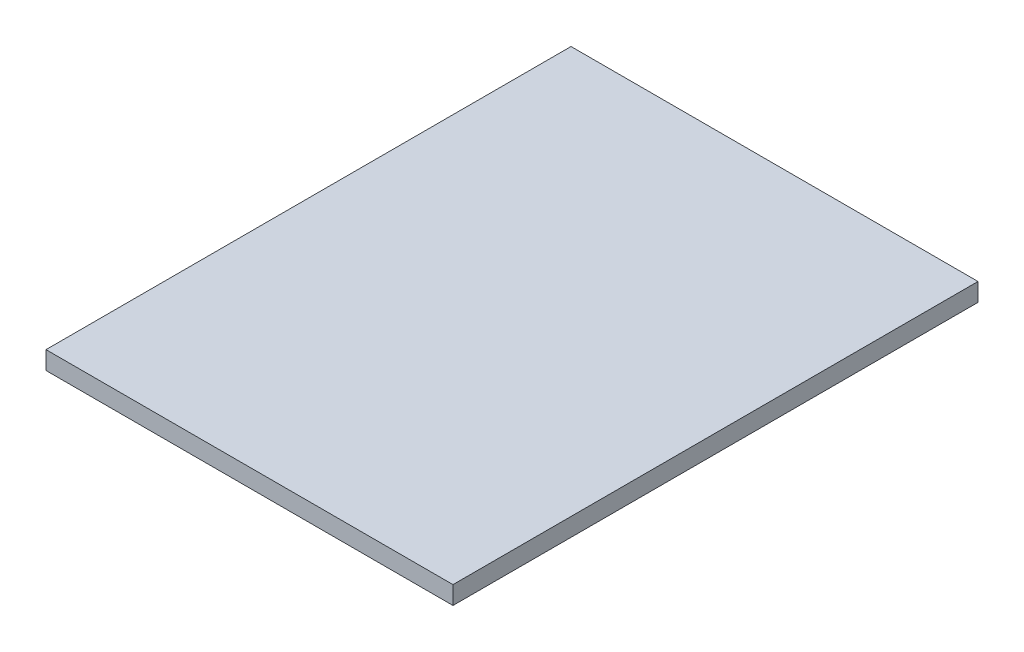
ISO-10303-21;
HEADER;
FILE_DESCRIPTION(('STEP AP214'),'2;1');
FILE_NAME('part.step','',(''),(''),'','','');
FILE_SCHEMA(('AUTOMOTIVE_DESIGN { 1 0 10303 214 1 1 1 1 }'));
ENDSEC;
DATA;
#1=APPLICATION_CONTEXT('core data for automotive mechanical design processes');
#2=APPLICATION_PROTOCOL_DEFINITION('international standard','automotive_design',2000,#1);
#3=PRODUCT_CONTEXT('',#1,'mechanical');
#4=PRODUCT('Part','Part','',(#3));
#5=PRODUCT_RELATED_PRODUCT_CATEGORY('part','',(#4));
#6=PRODUCT_DEFINITION_FORMATION('','',#4);
#7=PRODUCT_DEFINITION_CONTEXT('part definition',#1,'design');
#8=PRODUCT_DEFINITION('design','',#6,#7);
#9=PRODUCT_DEFINITION_SHAPE('','',#8);
#10=(LENGTH_UNIT() NAMED_UNIT(*) SI_UNIT(.MILLI.,.METRE.));
#11=(NAMED_UNIT(*) PLANE_ANGLE_UNIT() SI_UNIT($,.RADIAN.));
#12=(NAMED_UNIT(*) SI_UNIT($,.STERADIAN.) SOLID_ANGLE_UNIT());
#13=UNCERTAINTY_MEASURE_WITH_UNIT(LENGTH_MEASURE(1.E-05),#10,'distance_accuracy_value','');
#14=(GEOMETRIC_REPRESENTATION_CONTEXT(3) GLOBAL_UNCERTAINTY_ASSIGNED_CONTEXT((#13)) GLOBAL_UNIT_ASSIGNED_CONTEXT((#10,
#11,#12)) REPRESENTATION_CONTEXT('',''));
#15=CARTESIAN_POINT('',(0.,0.,0.));
#16=DIRECTION('',(0.,0.,1.));
#17=DIRECTION('',(1.,0.,0.));
#18=AXIS2_PLACEMENT_3D('',#15,#16,#17);
#19=CARTESIAN_POINT('',(0.,1.,0.));
#20=DIRECTION('',(1.,0.,0.));
#21=DIRECTION('',(0.,0.,-1.));
#22=AXIS2_PLACEMENT_3D('',#19,#20,#21);
#23=PLANE('',#22);
#24=DIRECTION('',(0.,0.,1.));
#25=VECTOR('',#24,1.);
#26=CARTESIAN_POINT('',(0.,0.,0.));
#27=LINE('',#26,#25);
#28=CARTESIAN_POINT('',(0.,0.,-29.));
#29=VERTEX_POINT('',#28);
#30=CARTESIAN_POINT('',(0.,0.,0.));
#31=VERTEX_POINT('',#30);
#32=EDGE_CURVE('E97',#29,#31,#27,.T.);
#33=ORIENTED_EDGE('',*,*,#32,.T.);
#34=DIRECTION('',(0.,-1.,0.));
#35=VECTOR('',#34,1.);
#36=CARTESIAN_POINT('',(0.,1.,0.));
#37=LINE('',#36,#35);
#38=CARTESIAN_POINT('',(0.,1.,0.));
#39=VERTEX_POINT('',#38);
#40=EDGE_CURVE('E11',#39,#31,#37,.T.);
#41=ORIENTED_EDGE('',*,*,#40,.F.);
#42=DIRECTION('',(0.,0.,1.));
#43=VECTOR('',#42,1.);
#44=CARTESIAN_POINT('',(0.,1.,0.));
#45=LINE('',#44,#43);
#46=CARTESIAN_POINT('',(0.,1.,-29.));
#47=VERTEX_POINT('',#46);
#48=EDGE_CURVE('E85',#47,#39,#45,.T.);
#49=ORIENTED_EDGE('',*,*,#48,.F.);
#50=DIRECTION('',(0.,-1.,0.));
#51=VECTOR('',#50,1.);
#52=CARTESIAN_POINT('',(0.,1.,-29.));
#53=LINE('',#52,#51);
#54=EDGE_CURVE('E93',#47,#29,#53,.T.);
#55=ORIENTED_EDGE('',*,*,#54,.T.);
#56=EDGE_LOOP('',(#33,#41,#49,#55));
#57=FACE_BOUND('',#56,.T.);
#58=ADVANCED_FACE('F34',(#57),#23,.F.);
#59=CARTESIAN_POINT('',(0.,1.,0.));
#60=DIRECTION('',(0.,0.,-1.));
#61=DIRECTION('',(-1.,0.,0.));
#62=AXIS2_PLACEMENT_3D('',#59,#60,#61);
#63=PLANE('',#62);
#64=DIRECTION('',(1.,0.,0.));
#65=VECTOR('',#64,1.);
#66=CARTESIAN_POINT('',(0.,0.,0.));
#67=LINE('',#66,#65);
#68=CARTESIAN_POINT('',(22.48,0.,0.));
#69=VERTEX_POINT('',#68);
#70=EDGE_CURVE('E89',#31,#69,#67,.T.);
#71=ORIENTED_EDGE('',*,*,#70,.T.);
#72=DIRECTION('',(0.,-1.,0.));
#73=VECTOR('',#72,1.);
#74=CARTESIAN_POINT('',(22.48,1.,0.));
#75=LINE('',#74,#73);
#76=CARTESIAN_POINT('',(22.48,1.,0.));
#77=VERTEX_POINT('',#76);
#78=EDGE_CURVE('E42',#77,#69,#75,.T.);
#79=ORIENTED_EDGE('',*,*,#78,.F.);
#80=DIRECTION('',(1.,0.,0.));
#81=VECTOR('',#80,1.);
#82=CARTESIAN_POINT('',(0.,1.,0.));
#83=LINE('',#82,#81);
#84=EDGE_CURVE('E80',#39,#77,#83,.T.);
#85=ORIENTED_EDGE('',*,*,#84,.F.);
#86=ORIENTED_EDGE('',*,*,#40,.T.);
#87=EDGE_LOOP('',(#71,#79,#85,#86));
#88=FACE_BOUND('',#87,.T.);
#89=ADVANCED_FACE('F88',(#88),#63,.F.);
#90=CARTESIAN_POINT('',(22.48,1.,0.));
#91=DIRECTION('',(-1.,0.,0.));
#92=DIRECTION('',(0.,0.,1.));
#93=AXIS2_PLACEMENT_3D('',#90,#91,#92);
#94=PLANE('',#93);
#95=DIRECTION('',(0.,0.,-1.));
#96=VECTOR('',#95,1.);
#97=CARTESIAN_POINT('',(22.48,0.,0.));
#98=LINE('',#97,#96);
#99=CARTESIAN_POINT('',(22.48,0.,-29.));
#100=VERTEX_POINT('',#99);
#101=EDGE_CURVE('E67',#69,#100,#98,.T.);
#102=ORIENTED_EDGE('',*,*,#101,.T.);
#103=DIRECTION('',(0.,-1.,0.));
#104=VECTOR('',#103,1.);
#105=CARTESIAN_POINT('',(22.48,1.,-29.));
#106=LINE('',#105,#104);
#107=CARTESIAN_POINT('',(22.48,1.,-29.));
#108=VERTEX_POINT('',#107);
#109=EDGE_CURVE('E90',#108,#100,#106,.T.);
#110=ORIENTED_EDGE('',*,*,#109,.F.);
#111=DIRECTION('',(0.,0.,-1.));
#112=VECTOR('',#111,1.);
#113=CARTESIAN_POINT('',(22.48,1.,0.));
#114=LINE('',#113,#112);
#115=EDGE_CURVE('E83',#77,#108,#114,.T.);
#116=ORIENTED_EDGE('',*,*,#115,.F.);
#117=ORIENTED_EDGE('',*,*,#78,.T.);
#118=EDGE_LOOP('',(#102,#110,#116,#117));
#119=FACE_BOUND('',#118,.T.);
#120=ADVANCED_FACE('F91',(#119),#94,.F.);
#121=CARTESIAN_POINT('',(0.,1.,-29.));
#122=DIRECTION('',(0.,0.,1.));
#123=DIRECTION('',(1.,0.,0.));
#124=AXIS2_PLACEMENT_3D('',#121,#122,#123);
#125=PLANE('',#124);
#126=DIRECTION('',(-1.,0.,0.));
#127=VECTOR('',#126,1.);
#128=CARTESIAN_POINT('',(0.,0.,-29.));
#129=LINE('',#128,#127);
#130=EDGE_CURVE('E73',#100,#29,#129,.T.);
#131=ORIENTED_EDGE('',*,*,#130,.T.);
#132=ORIENTED_EDGE('',*,*,#54,.F.);
#133=DIRECTION('',(-1.,0.,0.));
#134=VECTOR('',#133,1.);
#135=CARTESIAN_POINT('',(0.,1.,-29.));
#136=LINE('',#135,#134);
#137=EDGE_CURVE('E50',#108,#47,#136,.T.);
#138=ORIENTED_EDGE('',*,*,#137,.F.);
#139=ORIENTED_EDGE('',*,*,#109,.T.);
#140=EDGE_LOOP('',(#131,#132,#138,#139));
#141=FACE_BOUND('',#140,.T.);
#142=ADVANCED_FACE('F104',(#141),#125,.F.);
#143=CARTESIAN_POINT('',(0.,1.,0.));
#144=DIRECTION('',(0.,-1.,0.));
#145=DIRECTION('',(0.,0.,-1.));
#146=AXIS2_PLACEMENT_3D('',#143,#144,#145);
#147=PLANE('',#146);
#148=ORIENTED_EDGE('',*,*,#48,.T.);
#149=ORIENTED_EDGE('',*,*,#84,.T.);
#150=ORIENTED_EDGE('',*,*,#115,.T.);
#151=ORIENTED_EDGE('',*,*,#137,.T.);
#152=EDGE_LOOP('',(#148,#149,#150,#151));
#153=FACE_BOUND('',#152,.T.);
#154=ADVANCED_FACE('F81',(#153),#147,.F.);
#155=CARTESIAN_POINT('',(0.,0.,0.));
#156=DIRECTION('',(0.,-1.,0.));
#157=DIRECTION('',(0.,0.,-1.));
#158=AXIS2_PLACEMENT_3D('',#155,#156,#157);
#159=PLANE('',#158);
#160=ORIENTED_EDGE('',*,*,#32,.F.);
#161=ORIENTED_EDGE('',*,*,#130,.F.);
#162=ORIENTED_EDGE('',*,*,#101,.F.);
#163=ORIENTED_EDGE('',*,*,#70,.F.);
#164=EDGE_LOOP('',(#160,#161,#162,#163));
#165=FACE_BOUND('',#164,.T.);
#166=ADVANCED_FACE('F107',(#165),#159,.T.);
#167=CLOSED_SHELL('',(#58,#89,#120,#142,#154,#166));
#168=MANIFOLD_SOLID_BREP('B2',#167);
#169=ADVANCED_BREP_SHAPE_REPRESENTATION('',(#18,#168),#14);
#170=SHAPE_DEFINITION_REPRESENTATION(#9,#169);
ENDSEC;
END-ISO-10303-21;
